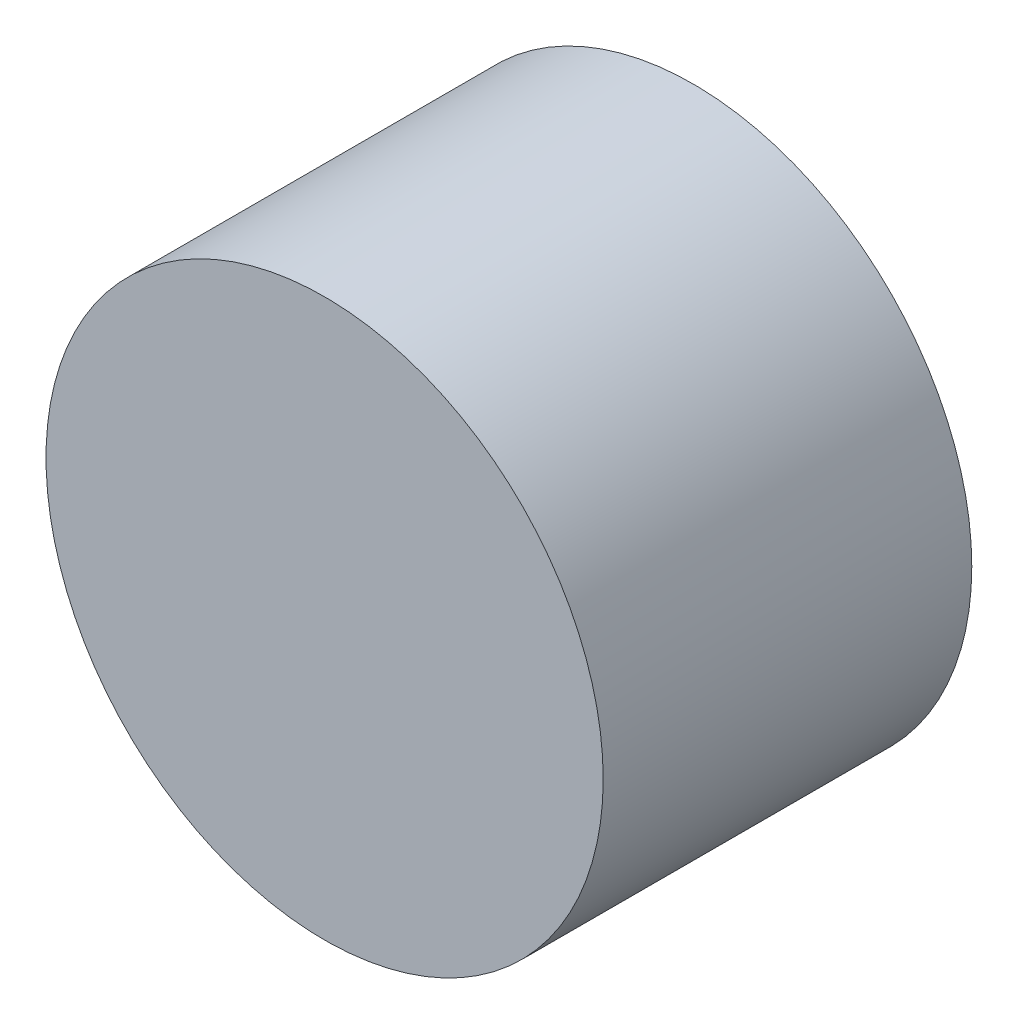
ISO-10303-21;
HEADER;
FILE_DESCRIPTION(('STEP AP214'),'2;1');
FILE_NAME('part.step','',(''),(''),'','','');
FILE_SCHEMA(('AUTOMOTIVE_DESIGN { 1 0 10303 214 1 1 1 1 }'));
ENDSEC;
DATA;
#1=APPLICATION_CONTEXT('core data for automotive mechanical design processes');
#2=APPLICATION_PROTOCOL_DEFINITION('international standard','automotive_design',2000,#1);
#3=PRODUCT_CONTEXT('',#1,'mechanical');
#4=PRODUCT('Part','Part','',(#3));
#5=PRODUCT_RELATED_PRODUCT_CATEGORY('part','',(#4));
#6=PRODUCT_DEFINITION_FORMATION('','',#4);
#7=PRODUCT_DEFINITION_CONTEXT('part definition',#1,'design');
#8=PRODUCT_DEFINITION('design','',#6,#7);
#9=PRODUCT_DEFINITION_SHAPE('','',#8);
#10=(LENGTH_UNIT() NAMED_UNIT(*) SI_UNIT(.MILLI.,.METRE.));
#11=(NAMED_UNIT(*) PLANE_ANGLE_UNIT() SI_UNIT($,.RADIAN.));
#12=(NAMED_UNIT(*) SI_UNIT($,.STERADIAN.) SOLID_ANGLE_UNIT());
#13=UNCERTAINTY_MEASURE_WITH_UNIT(LENGTH_MEASURE(1.E-05),#10,'distance_accuracy_value','');
#14=(GEOMETRIC_REPRESENTATION_CONTEXT(3) GLOBAL_UNCERTAINTY_ASSIGNED_CONTEXT((#13)) GLOBAL_UNIT_ASSIGNED_CONTEXT((#10,
#11,#12)) REPRESENTATION_CONTEXT('',''));
#15=CARTESIAN_POINT('',(0.,0.,0.));
#16=DIRECTION('',(0.,0.,1.));
#17=DIRECTION('',(1.,0.,0.));
#18=AXIS2_PLACEMENT_3D('',#15,#16,#17);
#19=CARTESIAN_POINT('',(0.,0.,43.));
#20=DIRECTION('',(0.,0.,-1.));
#21=DIRECTION('',(-1.,0.,0.));
#22=AXIS2_PLACEMENT_3D('',#19,#20,#21);
#23=CYLINDRICAL_SURFACE('',#22,32.5);
#24=CARTESIAN_POINT('',(0.,0.,43.));
#25=DIRECTION('',(0.,0.,1.));
#26=DIRECTION('',(1.,0.,0.));
#27=AXIS2_PLACEMENT_3D('',#24,#25,#26);
#28=CIRCLE('',#27,32.5);
#29=CARTESIAN_POINT('',(32.5,0.,43.));
#30=VERTEX_POINT('',#29);
#31=EDGE_CURVE('E10',#30,#30,#28,.T.);
#32=ORIENTED_EDGE('',*,*,#31,.F.);
#33=EDGE_LOOP('',(#32));
#34=FACE_BOUND('',#33,.T.);
#35=CARTESIAN_POINT('',(0.,0.,0.));
#36=DIRECTION('',(0.,0.,1.));
#37=DIRECTION('',(1.,0.,0.));
#38=AXIS2_PLACEMENT_3D('',#35,#36,#37);
#39=CIRCLE('',#38,32.5);
#40=CARTESIAN_POINT('',(32.5,0.,0.));
#41=VERTEX_POINT('',#40);
#42=EDGE_CURVE('E46',#41,#41,#39,.T.);
#43=ORIENTED_EDGE('',*,*,#42,.T.);
#44=EDGE_LOOP('',(#43));
#45=FACE_BOUND('',#44,.T.);
#46=ADVANCED_FACE('F43',(#34,#45),#23,.T.);
#47=CARTESIAN_POINT('',(0.,0.,43.));
#48=DIRECTION('',(0.,0.,1.));
#49=DIRECTION('',(1.,0.,0.));
#50=AXIS2_PLACEMENT_3D('',#47,#48,#49);
#51=PLANE('',#50);
#52=ORIENTED_EDGE('',*,*,#31,.T.);
#53=EDGE_LOOP('',(#52));
#54=FACE_BOUND('',#53,.T.);
#55=ADVANCED_FACE('F60',(#54),#51,.T.);
#56=CARTESIAN_POINT('',(0.,0.,0.));
#57=DIRECTION('',(0.,0.,1.));
#58=DIRECTION('',(1.,0.,0.));
#59=AXIS2_PLACEMENT_3D('',#56,#57,#58);
#60=PLANE('',#59);
#61=ORIENTED_EDGE('',*,*,#42,.F.);
#62=EDGE_LOOP('',(#61));
#63=FACE_BOUND('',#62,.T.);
#64=ADVANCED_FACE('F58',(#63),#60,.F.);
#65=CLOSED_SHELL('',(#46,#55,#64));
#66=MANIFOLD_SOLID_BREP('B2',#65);
#67=ADVANCED_BREP_SHAPE_REPRESENTATION('',(#18,#66),#14);
#68=SHAPE_DEFINITION_REPRESENTATION(#9,#67);
ENDSEC;
END-ISO-10303-21;
